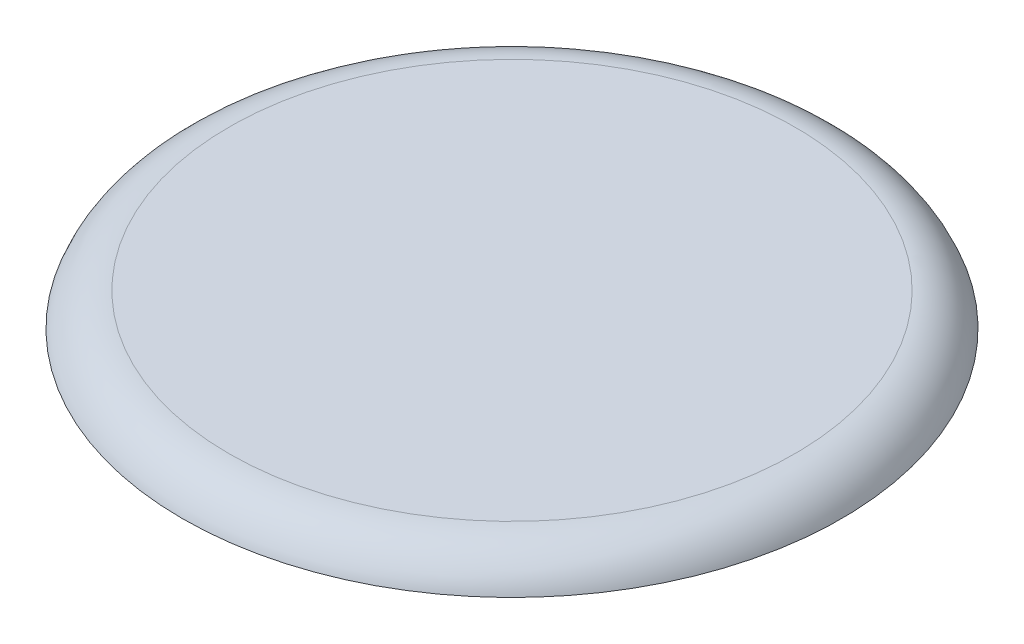
ISO-10303-21;
HEADER;
FILE_DESCRIPTION(('STEP AP214'),'2;1');
FILE_NAME('part.step','',(''),(''),'','','');
FILE_SCHEMA(('AUTOMOTIVE_DESIGN { 1 0 10303 214 1 1 1 1 }'));
ENDSEC;
DATA;
#1=APPLICATION_CONTEXT('core data for automotive mechanical design processes');
#2=APPLICATION_PROTOCOL_DEFINITION('international standard','automotive_design',2000,#1);
#3=PRODUCT_CONTEXT('',#1,'mechanical');
#4=PRODUCT('Part','Part','',(#3));
#5=PRODUCT_RELATED_PRODUCT_CATEGORY('part','',(#4));
#6=PRODUCT_DEFINITION_FORMATION('','',#4);
#7=PRODUCT_DEFINITION_CONTEXT('part definition',#1,'design');
#8=PRODUCT_DEFINITION('design','',#6,#7);
#9=PRODUCT_DEFINITION_SHAPE('','',#8);
#10=(LENGTH_UNIT() NAMED_UNIT(*) SI_UNIT(.MILLI.,.METRE.));
#11=(NAMED_UNIT(*) PLANE_ANGLE_UNIT() SI_UNIT($,.RADIAN.));
#12=(NAMED_UNIT(*) SI_UNIT($,.STERADIAN.) SOLID_ANGLE_UNIT());
#13=UNCERTAINTY_MEASURE_WITH_UNIT(LENGTH_MEASURE(1.E-05),#10,'distance_accuracy_value','');
#14=(GEOMETRIC_REPRESENTATION_CONTEXT(3) GLOBAL_UNCERTAINTY_ASSIGNED_CONTEXT((#13)) GLOBAL_UNIT_ASSIGNED_CONTEXT((#10,
#11,#12)) REPRESENTATION_CONTEXT('',''));
#15=CARTESIAN_POINT('',(0.,0.,0.));
#16=DIRECTION('',(0.,0.,1.));
#17=DIRECTION('',(1.,0.,0.));
#18=AXIS2_PLACEMENT_3D('',#15,#16,#17);
#19=CARTESIAN_POINT('',(0.,12.7,0.));
#20=DIRECTION('',(0.,1.,0.));
#21=DIRECTION('',(0.,0.,1.));
#22=AXIS2_PLACEMENT_3D('',#19,#20,#21);
#23=PLANE('',#22);
#24=CARTESIAN_POINT('',(0.,12.7,0.));
#25=DIRECTION('',(0.,1.,0.));
#26=DIRECTION('',(0.,0.,1.));
#27=AXIS2_PLACEMENT_3D('',#24,#25,#26);
#28=CIRCLE('',#27,109.039487757862);
#29=CARTESIAN_POINT('',(0.,12.7,109.039487757862));
#30=VERTEX_POINT('',#29);
#31=EDGE_CURVE('E10',#30,#30,#28,.T.);
#32=ORIENTED_EDGE('',*,*,#31,.T.);
#33=EDGE_LOOP('',(#32));
#34=FACE_BOUND('',#33,.T.);
#35=ADVANCED_FACE('F30',(#34),#23,.T.);
#36=CARTESIAN_POINT('',(0.,0.,0.));
#37=DIRECTION('',(0.,1.,0.));
#38=DIRECTION('',(0.,0.,1.));
#39=AXIS2_PLACEMENT_3D('',#36,#37,#38);
#40=PLANE('',#39);
#41=CARTESIAN_POINT('',(0.,0.,0.));
#42=DIRECTION('',(0.,-1.,0.));
#43=DIRECTION('',(0.,0.,-1.));
#44=AXIS2_PLACEMENT_3D('',#41,#42,#43);
#45=CIRCLE('',#44,111.125);
#46=CARTESIAN_POINT('',(0.,0.,-111.125));
#47=VERTEX_POINT('',#46);
#48=EDGE_CURVE('E45',#47,#47,#45,.T.);
#49=ORIENTED_EDGE('',*,*,#48,.F.);
#50=EDGE_LOOP('',(#49));
#51=FACE_BOUND('',#50,.T.);
#52=CARTESIAN_POINT('',(0.,0.,0.));
#53=DIRECTION('',(0.,1.,0.));
#54=DIRECTION('',(0.,0.,1.));
#55=AXIS2_PLACEMENT_3D('',#52,#53,#54);
#56=CIRCLE('',#55,127.);
#57=CARTESIAN_POINT('',(0.,0.,127.));
#58=VERTEX_POINT('',#57);
#59=EDGE_CURVE('E37',#58,#58,#56,.T.);
#60=ORIENTED_EDGE('',*,*,#59,.F.);
#61=EDGE_LOOP('',(#60));
#62=FACE_BOUND('',#61,.T.);
#63=ADVANCED_FACE('F53',(#51,#62),#40,.F.);
#64=CARTESIAN_POINT('',(0.,-6.35,0.));
#65=DIRECTION('',(0.,-1.,0.));
#66=DIRECTION('',(0.,0.,-1.));
#67=AXIS2_PLACEMENT_3D('',#64,#65,#66);
#68=TOROIDAL_SURFACE('',#67,109.039487757862,19.05);
#69=ORIENTED_EDGE('',*,*,#59,.T.);
#70=EDGE_LOOP('',(#69));
#71=FACE_BOUND('',#70,.T.);
#72=ORIENTED_EDGE('',*,*,#31,.F.);
#73=EDGE_LOOP('',(#72));
#74=FACE_BOUND('',#73,.T.);
#75=ADVANCED_FACE('F32',(#71,#74),#68,.T.);
#76=CARTESIAN_POINT('',(0.,2.54,0.));
#77=DIRECTION('',(0.,-1.,0.));
#78=DIRECTION('',(0.,0.,-1.));
#79=AXIS2_PLACEMENT_3D('',#76,#77,#78);
#80=CYLINDRICAL_SURFACE('',#79,111.125);
#81=CARTESIAN_POINT('',(0.,2.54,0.));
#82=DIRECTION('',(0.,-1.,0.));
#83=DIRECTION('',(0.,0.,-1.));
#84=AXIS2_PLACEMENT_3D('',#81,#82,#83);
#85=CIRCLE('',#84,111.125);
#86=CARTESIAN_POINT('',(0.,2.54,-111.125));
#87=VERTEX_POINT('',#86);
#88=EDGE_CURVE('E41',#87,#87,#85,.T.);
#89=ORIENTED_EDGE('',*,*,#88,.F.);
#90=EDGE_LOOP('',(#89));
#91=FACE_BOUND('',#90,.T.);
#92=ORIENTED_EDGE('',*,*,#48,.T.);
#93=EDGE_LOOP('',(#92));
#94=FACE_BOUND('',#93,.T.);
#95=ADVANCED_FACE('F51',(#91,#94),#80,.F.);
#96=CARTESIAN_POINT('',(0.,2.54,0.));
#97=DIRECTION('',(0.,-1.,0.));
#98=DIRECTION('',(0.,0.,-1.));
#99=AXIS2_PLACEMENT_3D('',#96,#97,#98);
#100=PLANE('',#99);
#101=ORIENTED_EDGE('',*,*,#88,.T.);
#102=EDGE_LOOP('',(#101));
#103=FACE_BOUND('',#102,.T.);
#104=ADVANCED_FACE('F64',(#103),#100,.T.);
#105=CLOSED_SHELL('',(#35,#63,#75,#95,#104));
#106=MANIFOLD_SOLID_BREP('B2',#105);
#107=ADVANCED_BREP_SHAPE_REPRESENTATION('',(#18,#106),#14);
#108=SHAPE_DEFINITION_REPRESENTATION(#9,#107);
ENDSEC;
END-ISO-10303-21;
